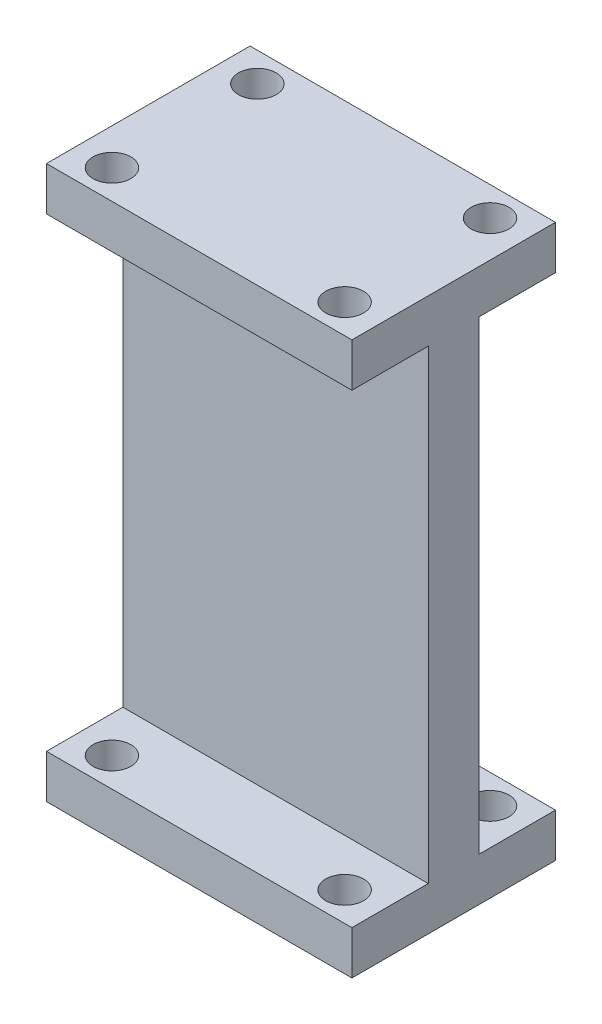
ISO-10303-21;
HEADER;
FILE_DESCRIPTION(('STEP AP214'),'2;1');
FILE_NAME('part.step','',(''),(''),'','','');
FILE_SCHEMA(('AUTOMOTIVE_DESIGN { 1 0 10303 214 1 1 1 1 }'));
ENDSEC;
DATA;
#1=APPLICATION_CONTEXT('core data for automotive mechanical design processes');
#2=APPLICATION_PROTOCOL_DEFINITION('international standard','automotive_design',2000,#1);
#3=PRODUCT_CONTEXT('',#1,'mechanical');
#4=PRODUCT('Part','Part','',(#3));
#5=PRODUCT_RELATED_PRODUCT_CATEGORY('part','',(#4));
#6=PRODUCT_DEFINITION_FORMATION('','',#4);
#7=PRODUCT_DEFINITION_CONTEXT('part definition',#1,'design');
#8=PRODUCT_DEFINITION('design','',#6,#7);
#9=PRODUCT_DEFINITION_SHAPE('','',#8);
#10=(LENGTH_UNIT() NAMED_UNIT(*) SI_UNIT(.MILLI.,.METRE.));
#11=(NAMED_UNIT(*) PLANE_ANGLE_UNIT() SI_UNIT($,.RADIAN.));
#12=(NAMED_UNIT(*) SI_UNIT($,.STERADIAN.) SOLID_ANGLE_UNIT());
#13=UNCERTAINTY_MEASURE_WITH_UNIT(LENGTH_MEASURE(1.E-05),#10,'distance_accuracy_value','');
#14=(GEOMETRIC_REPRESENTATION_CONTEXT(3) GLOBAL_UNCERTAINTY_ASSIGNED_CONTEXT((#13)) GLOBAL_UNIT_ASSIGNED_CONTEXT((#10,
#11,#12)) REPRESENTATION_CONTEXT('',''));
#15=CARTESIAN_POINT('',(0.,0.,0.));
#16=DIRECTION('',(0.,0.,1.));
#17=DIRECTION('',(1.,0.,0.));
#18=AXIS2_PLACEMENT_3D('',#15,#16,#17);
#19=CARTESIAN_POINT('',(0.,3.,0.));
#20=DIRECTION('',(0.,1.,0.));
#21=DIRECTION('',(0.,0.,1.));
#22=AXIS2_PLACEMENT_3D('',#19,#20,#21);
#23=PLANE('',#22);
#24=DIRECTION('',(1.,0.,0.));
#25=VECTOR('',#24,1.);
#26=CARTESIAN_POINT('',(-10.5,3.,1.75));
#27=LINE('',#26,#25);
#28=CARTESIAN_POINT('',(-10.5,3.,1.75));
#29=VERTEX_POINT('',#28);
#30=CARTESIAN_POINT('',(10.5,3.,1.75));
#31=VERTEX_POINT('',#30);
#32=EDGE_CURVE('E48',#29,#31,#27,.T.);
#33=ORIENTED_EDGE('',*,*,#32,.F.);
#34=DIRECTION('',(0.,0.,1.));
#35=VECTOR('',#34,1.);
#36=CARTESIAN_POINT('',(-10.5,3.,-7.));
#37=LINE('',#36,#35);
#38=CARTESIAN_POINT('',(-10.5,3.,7.));
#39=VERTEX_POINT('',#38);
#40=EDGE_CURVE('E204',#29,#39,#37,.T.);
#41=ORIENTED_EDGE('',*,*,#40,.T.);
#42=DIRECTION('',(1.,0.,0.));
#43=VECTOR('',#42,1.);
#44=CARTESIAN_POINT('',(-10.5,3.,7.));
#45=LINE('',#44,#43);
#46=CARTESIAN_POINT('',(10.5,3.,7.));
#47=VERTEX_POINT('',#46);
#48=EDGE_CURVE('E207',#39,#47,#45,.T.);
#49=ORIENTED_EDGE('',*,*,#48,.T.);
#50=DIRECTION('',(0.,0.,-1.));
#51=VECTOR('',#50,1.);
#52=CARTESIAN_POINT('',(10.5,3.,-7.));
#53=LINE('',#52,#51);
#54=EDGE_CURVE('E199',#47,#31,#53,.T.);
#55=ORIENTED_EDGE('',*,*,#54,.T.);
#56=EDGE_LOOP('',(#33,#41,#49,#55));
#57=FACE_BOUND('',#56,.T.);
#58=CARTESIAN_POINT('',(8.,3.,5.));
#59=DIRECTION('',(0.,1.,0.));
#60=DIRECTION('',(0.,0.,1.));
#61=AXIS2_PLACEMENT_3D('',#58,#59,#60);
#62=CIRCLE('',#61,1.3);
#63=CARTESIAN_POINT('',(8.,3.,6.3));
#64=VERTEX_POINT('',#63);
#65=EDGE_CURVE('E187',#64,#64,#62,.T.);
#66=ORIENTED_EDGE('',*,*,#65,.F.);
#67=EDGE_LOOP('',(#66));
#68=FACE_BOUND('',#67,.T.);
#69=CARTESIAN_POINT('',(-8.,3.,5.));
#70=DIRECTION('',(0.,1.,0.));
#71=DIRECTION('',(0.,0.,1.));
#72=AXIS2_PLACEMENT_3D('',#69,#70,#71);
#73=CIRCLE('',#72,1.3);
#74=CARTESIAN_POINT('',(-8.,3.,6.3));
#75=VERTEX_POINT('',#74);
#76=EDGE_CURVE('E193',#75,#75,#73,.T.);
#77=ORIENTED_EDGE('',*,*,#76,.F.);
#78=EDGE_LOOP('',(#77));
#79=FACE_BOUND('',#78,.T.);
#80=ADVANCED_FACE('F33',(#57,#68,#79),#23,.T.);
#81=DIRECTION('',(-1.,0.,0.));
#82=VECTOR('',#81,1.);
#83=CARTESIAN_POINT('',(-10.5,3.,-1.75));
#84=LINE('',#83,#82);
#85=CARTESIAN_POINT('',(10.5,3.,-1.75));
#86=VERTEX_POINT('',#85);
#87=CARTESIAN_POINT('',(-10.5,3.,-1.75));
#88=VERTEX_POINT('',#87);
#89=EDGE_CURVE('E56',#86,#88,#84,.T.);
#90=ORIENTED_EDGE('',*,*,#89,.F.);
#91=CARTESIAN_POINT('',(10.5,3.,-7.));
#92=VERTEX_POINT('',#91);
#93=EDGE_CURVE('E202',#86,#92,#53,.T.);
#94=ORIENTED_EDGE('',*,*,#93,.T.);
#95=DIRECTION('',(-1.,0.,0.));
#96=VECTOR('',#95,1.);
#97=CARTESIAN_POINT('',(-10.5,3.,-7.));
#98=LINE('',#97,#96);
#99=CARTESIAN_POINT('',(-10.5,3.,-7.));
#100=VERTEX_POINT('',#99);
#101=EDGE_CURVE('E201',#92,#100,#98,.T.);
#102=ORIENTED_EDGE('',*,*,#101,.T.);
#103=EDGE_CURVE('E205',#100,#88,#37,.T.);
#104=ORIENTED_EDGE('',*,*,#103,.T.);
#105=EDGE_LOOP('',(#90,#94,#102,#104));
#106=FACE_BOUND('',#105,.T.);
#107=CARTESIAN_POINT('',(8.,3.,-5.));
#108=DIRECTION('',(0.,1.,0.));
#109=DIRECTION('',(0.,0.,-1.));
#110=AXIS2_PLACEMENT_3D('',#107,#108,#109);
#111=CIRCLE('',#110,1.3);
#112=CARTESIAN_POINT('',(8.,3.,-6.3));
#113=VERTEX_POINT('',#112);
#114=EDGE_CURVE('E181',#113,#113,#111,.T.);
#115=ORIENTED_EDGE('',*,*,#114,.F.);
#116=EDGE_LOOP('',(#115));
#117=FACE_BOUND('',#116,.T.);
#118=CARTESIAN_POINT('',(-8.,3.,-5.));
#119=DIRECTION('',(0.,1.,0.));
#120=DIRECTION('',(0.,0.,-1.));
#121=AXIS2_PLACEMENT_3D('',#118,#119,#120);
#122=CIRCLE('',#121,1.3);
#123=CARTESIAN_POINT('',(-8.,3.,-6.3));
#124=VERTEX_POINT('',#123);
#125=EDGE_CURVE('E175',#124,#124,#122,.T.);
#126=ORIENTED_EDGE('',*,*,#125,.F.);
#127=EDGE_LOOP('',(#126));
#128=FACE_BOUND('',#127,.T.);
#129=ADVANCED_FACE('F273',(#106,#117,#128),#23,.T.);
#130=CARTESIAN_POINT('',(0.,0.,0.));
#131=DIRECTION('',(0.,1.,0.));
#132=DIRECTION('',(0.,0.,1.));
#133=AXIS2_PLACEMENT_3D('',#130,#131,#132);
#134=PLANE('',#133);
#135=DIRECTION('',(0.,0.,-1.));
#136=VECTOR('',#135,1.);
#137=CARTESIAN_POINT('',(10.5,0.,-7.));
#138=LINE('',#137,#136);
#139=CARTESIAN_POINT('',(10.5,0.,7.));
#140=VERTEX_POINT('',#139);
#141=CARTESIAN_POINT('',(10.5,0.,-7.));
#142=VERTEX_POINT('',#141);
#143=EDGE_CURVE('E196',#140,#142,#138,.T.);
#144=ORIENTED_EDGE('',*,*,#143,.F.);
#145=DIRECTION('',(1.,0.,0.));
#146=VECTOR('',#145,1.);
#147=CARTESIAN_POINT('',(-10.5,0.,7.));
#148=LINE('',#147,#146);
#149=CARTESIAN_POINT('',(-10.5,0.,7.));
#150=VERTEX_POINT('',#149);
#151=EDGE_CURVE('E215',#150,#140,#148,.T.);
#152=ORIENTED_EDGE('',*,*,#151,.F.);
#153=DIRECTION('',(0.,0.,1.));
#154=VECTOR('',#153,1.);
#155=CARTESIAN_POINT('',(-10.5,0.,-7.));
#156=LINE('',#155,#154);
#157=CARTESIAN_POINT('',(-10.5,0.,-7.));
#158=VERTEX_POINT('',#157);
#159=EDGE_CURVE('E213',#158,#150,#156,.T.);
#160=ORIENTED_EDGE('',*,*,#159,.F.);
#161=DIRECTION('',(-1.,0.,0.));
#162=VECTOR('',#161,1.);
#163=CARTESIAN_POINT('',(-10.5,0.,-7.));
#164=LINE('',#163,#162);
#165=EDGE_CURVE('E211',#142,#158,#164,.T.);
#166=ORIENTED_EDGE('',*,*,#165,.F.);
#167=EDGE_LOOP('',(#144,#152,#160,#166));
#168=FACE_BOUND('',#167,.T.);
#169=CARTESIAN_POINT('',(-8.,0.,5.));
#170=DIRECTION('',(0.,1.,0.));
#171=DIRECTION('',(0.,0.,1.));
#172=AXIS2_PLACEMENT_3D('',#169,#170,#171);
#173=CIRCLE('',#172,1.3);
#174=CARTESIAN_POINT('',(-8.,0.,6.3));
#175=VERTEX_POINT('',#174);
#176=EDGE_CURVE('E190',#175,#175,#173,.T.);
#177=ORIENTED_EDGE('',*,*,#176,.T.);
#178=EDGE_LOOP('',(#177));
#179=FACE_BOUND('',#178,.T.);
#180=CARTESIAN_POINT('',(8.,0.,5.));
#181=DIRECTION('',(0.,1.,0.));
#182=DIRECTION('',(0.,0.,1.));
#183=AXIS2_PLACEMENT_3D('',#180,#181,#182);
#184=CIRCLE('',#183,1.3);
#185=CARTESIAN_POINT('',(8.,0.,6.3));
#186=VERTEX_POINT('',#185);
#187=EDGE_CURVE('E184',#186,#186,#184,.T.);
#188=ORIENTED_EDGE('',*,*,#187,.T.);
#189=EDGE_LOOP('',(#188));
#190=FACE_BOUND('',#189,.T.);
#191=CARTESIAN_POINT('',(8.,0.,-5.));
#192=DIRECTION('',(0.,1.,0.));
#193=DIRECTION('',(0.,0.,-1.));
#194=AXIS2_PLACEMENT_3D('',#191,#192,#193);
#195=CIRCLE('',#194,1.3);
#196=CARTESIAN_POINT('',(8.,0.,-6.3));
#197=VERTEX_POINT('',#196);
#198=EDGE_CURVE('E178',#197,#197,#195,.T.);
#199=ORIENTED_EDGE('',*,*,#198,.T.);
#200=EDGE_LOOP('',(#199));
#201=FACE_BOUND('',#200,.T.);
#202=CARTESIAN_POINT('',(-8.,0.,-5.));
#203=DIRECTION('',(0.,1.,0.));
#204=DIRECTION('',(0.,0.,-1.));
#205=AXIS2_PLACEMENT_3D('',#202,#203,#204);
#206=CIRCLE('',#205,1.3);
#207=CARTESIAN_POINT('',(-8.,0.,-6.3));
#208=VERTEX_POINT('',#207);
#209=EDGE_CURVE('E174',#208,#208,#206,.T.);
#210=ORIENTED_EDGE('',*,*,#209,.T.);
#211=EDGE_LOOP('',(#210));
#212=FACE_BOUND('',#211,.T.);
#213=ADVANCED_FACE('F233',(#168,#179,#190,#201,#212),#134,.F.);
#214=CARTESIAN_POINT('',(10.5,3.,-7.));
#215=DIRECTION('',(-1.,0.,0.));
#216=DIRECTION('',(0.,0.,1.));
#217=AXIS2_PLACEMENT_3D('',#214,#215,#216);
#218=PLANE('',#217);
#219=ORIENTED_EDGE('',*,*,#143,.T.);
#220=DIRECTION('',(0.,-1.,0.));
#221=VECTOR('',#220,1.);
#222=CARTESIAN_POINT('',(10.5,3.,-7.));
#223=LINE('',#222,#221);
#224=EDGE_CURVE('E11',#92,#142,#223,.T.);
#225=ORIENTED_EDGE('',*,*,#224,.F.);
#226=ORIENTED_EDGE('',*,*,#93,.F.);
#227=DIRECTION('',(0.,-1.,0.));
#228=VECTOR('',#227,1.);
#229=CARTESIAN_POINT('',(10.5,35.,-1.75));
#230=LINE('',#229,#228);
#231=CARTESIAN_POINT('',(10.5,35.,-1.75));
#232=VERTEX_POINT('',#231);
#233=EDGE_CURVE('E171',#232,#86,#230,.T.);
#234=ORIENTED_EDGE('',*,*,#233,.F.);
#235=DIRECTION('',(0.,0.,-1.));
#236=VECTOR('',#235,1.);
#237=CARTESIAN_POINT('',(10.5,35.,-7.));
#238=LINE('',#237,#236);
#239=CARTESIAN_POINT('',(10.5,35.,-7.));
#240=VERTEX_POINT('',#239);
#241=EDGE_CURVE('E147',#232,#240,#238,.T.);
#242=ORIENTED_EDGE('',*,*,#241,.T.);
#243=DIRECTION('',(0.,-1.,0.));
#244=VECTOR('',#243,1.);
#245=CARTESIAN_POINT('',(10.5,38.,-7.));
#246=LINE('',#245,#244);
#247=CARTESIAN_POINT('',(10.5,38.,-7.));
#248=VERTEX_POINT('',#247);
#249=EDGE_CURVE('E126',#248,#240,#246,.T.);
#250=ORIENTED_EDGE('',*,*,#249,.F.);
#251=DIRECTION('',(0.,0.,-1.));
#252=VECTOR('',#251,1.);
#253=CARTESIAN_POINT('',(10.5,38.,-7.));
#254=LINE('',#253,#252);
#255=CARTESIAN_POINT('',(10.5,38.,7.));
#256=VERTEX_POINT('',#255);
#257=EDGE_CURVE('E132',#256,#248,#254,.T.);
#258=ORIENTED_EDGE('',*,*,#257,.F.);
#259=DIRECTION('',(0.,-1.,0.));
#260=VECTOR('',#259,1.);
#261=CARTESIAN_POINT('',(10.5,38.,7.));
#262=LINE('',#261,#260);
#263=CARTESIAN_POINT('',(10.5,35.,7.));
#264=VERTEX_POINT('',#263);
#265=EDGE_CURVE('E257',#256,#264,#262,.T.);
#266=ORIENTED_EDGE('',*,*,#265,.T.);
#267=CARTESIAN_POINT('',(10.5,35.,1.75));
#268=VERTEX_POINT('',#267);
#269=EDGE_CURVE('E260',#264,#268,#238,.T.);
#270=ORIENTED_EDGE('',*,*,#269,.T.);
#271=DIRECTION('',(0.,-1.,0.));
#272=VECTOR('',#271,1.);
#273=CARTESIAN_POINT('',(10.5,35.,1.75));
#274=LINE('',#273,#272);
#275=EDGE_CURVE('E160',#268,#31,#274,.T.);
#276=ORIENTED_EDGE('',*,*,#275,.T.);
#277=ORIENTED_EDGE('',*,*,#54,.F.);
#278=DIRECTION('',(0.,-1.,0.));
#279=VECTOR('',#278,1.);
#280=CARTESIAN_POINT('',(10.5,3.,7.));
#281=LINE('',#280,#279);
#282=EDGE_CURVE('E209',#47,#140,#281,.T.);
#283=ORIENTED_EDGE('',*,*,#282,.T.);
#284=EDGE_LOOP('',(#219,#225,#226,#234,#242,#250,#258,#266,#270,#276,#277,#283));
#285=FACE_BOUND('',#284,.T.);
#286=ADVANCED_FACE('F35',(#285),#218,.F.);
#287=CARTESIAN_POINT('',(-10.5,3.,-7.));
#288=DIRECTION('',(0.,0.,1.));
#289=DIRECTION('',(1.,0.,0.));
#290=AXIS2_PLACEMENT_3D('',#287,#288,#289);
#291=PLANE('',#290);
#292=ORIENTED_EDGE('',*,*,#165,.T.);
#293=DIRECTION('',(0.,-1.,0.));
#294=VECTOR('',#293,1.);
#295=CARTESIAN_POINT('',(-10.5,3.,-7.));
#296=LINE('',#295,#294);
#297=EDGE_CURVE('E41',#100,#158,#296,.T.);
#298=ORIENTED_EDGE('',*,*,#297,.F.);
#299=ORIENTED_EDGE('',*,*,#101,.F.);
#300=ORIENTED_EDGE('',*,*,#224,.T.);
#301=EDGE_LOOP('',(#292,#298,#299,#300));
#302=FACE_BOUND('',#301,.T.);
#303=ADVANCED_FACE('F275',(#302),#291,.F.);
#304=CARTESIAN_POINT('',(-10.5,3.,-7.));
#305=DIRECTION('',(1.,0.,0.));
#306=DIRECTION('',(0.,0.,-1.));
#307=AXIS2_PLACEMENT_3D('',#304,#305,#306);
#308=PLANE('',#307);
#309=ORIENTED_EDGE('',*,*,#159,.T.);
#310=DIRECTION('',(0.,-1.,0.));
#311=VECTOR('',#310,1.);
#312=CARTESIAN_POINT('',(-10.5,3.,7.));
#313=LINE('',#312,#311);
#314=EDGE_CURVE('E219',#39,#150,#313,.T.);
#315=ORIENTED_EDGE('',*,*,#314,.F.);
#316=ORIENTED_EDGE('',*,*,#40,.F.);
#317=DIRECTION('',(0.,-1.,0.));
#318=VECTOR('',#317,1.);
#319=CARTESIAN_POINT('',(-10.5,35.,1.75));
#320=LINE('',#319,#318);
#321=CARTESIAN_POINT('',(-10.5,35.,1.75));
#322=VERTEX_POINT('',#321);
#323=EDGE_CURVE('E165',#322,#29,#320,.T.);
#324=ORIENTED_EDGE('',*,*,#323,.F.);
#325=DIRECTION('',(0.,0.,1.));
#326=VECTOR('',#325,1.);
#327=CARTESIAN_POINT('',(-10.5,35.,-7.));
#328=LINE('',#327,#326);
#329=CARTESIAN_POINT('',(-10.5,35.,7.));
#330=VERTEX_POINT('',#329);
#331=EDGE_CURVE('E248',#322,#330,#328,.T.);
#332=ORIENTED_EDGE('',*,*,#331,.T.);
#333=DIRECTION('',(0.,-1.,0.));
#334=VECTOR('',#333,1.);
#335=CARTESIAN_POINT('',(-10.5,38.,7.));
#336=LINE('',#335,#334);
#337=CARTESIAN_POINT('',(-10.5,38.,7.));
#338=VERTEX_POINT('',#337);
#339=EDGE_CURVE('E151',#338,#330,#336,.T.);
#340=ORIENTED_EDGE('',*,*,#339,.F.);
#341=DIRECTION('',(0.,0.,1.));
#342=VECTOR('',#341,1.);
#343=CARTESIAN_POINT('',(-10.5,38.,-7.));
#344=LINE('',#343,#342);
#345=CARTESIAN_POINT('',(-10.5,38.,-7.));
#346=VERTEX_POINT('',#345);
#347=EDGE_CURVE('E131',#346,#338,#344,.T.);
#348=ORIENTED_EDGE('',*,*,#347,.F.);
#349=DIRECTION('',(0.,-1.,0.));
#350=VECTOR('',#349,1.);
#351=CARTESIAN_POINT('',(-10.5,38.,-7.));
#352=LINE('',#351,#350);
#353=CARTESIAN_POINT('',(-10.5,35.,-7.));
#354=VERTEX_POINT('',#353);
#355=EDGE_CURVE('E128',#346,#354,#352,.T.);
#356=ORIENTED_EDGE('',*,*,#355,.T.);
#357=CARTESIAN_POINT('',(-10.5,35.,-1.75));
#358=VERTEX_POINT('',#357);
#359=EDGE_CURVE('E252',#354,#358,#328,.T.);
#360=ORIENTED_EDGE('',*,*,#359,.T.);
#361=DIRECTION('',(0.,-1.,0.));
#362=VECTOR('',#361,1.);
#363=CARTESIAN_POINT('',(-10.5,35.,-1.75));
#364=LINE('',#363,#362);
#365=EDGE_CURVE('E168',#358,#88,#364,.T.);
#366=ORIENTED_EDGE('',*,*,#365,.T.);
#367=ORIENTED_EDGE('',*,*,#103,.F.);
#368=ORIENTED_EDGE('',*,*,#297,.T.);
#369=EDGE_LOOP('',(#309,#315,#316,#324,#332,#340,#348,#356,#360,#366,#367,#368));
#370=FACE_BOUND('',#369,.T.);
#371=ADVANCED_FACE('F226',(#370),#308,.F.);
#372=CARTESIAN_POINT('',(-10.5,3.,7.));
#373=DIRECTION('',(0.,0.,-1.));
#374=DIRECTION('',(-1.,0.,0.));
#375=AXIS2_PLACEMENT_3D('',#372,#373,#374);
#376=PLANE('',#375);
#377=ORIENTED_EDGE('',*,*,#151,.T.);
#378=ORIENTED_EDGE('',*,*,#282,.F.);
#379=ORIENTED_EDGE('',*,*,#48,.F.);
#380=ORIENTED_EDGE('',*,*,#314,.T.);
#381=EDGE_LOOP('',(#377,#378,#379,#380));
#382=FACE_BOUND('',#381,.T.);
#383=ADVANCED_FACE('F237',(#382),#376,.F.);
#384=CARTESIAN_POINT('',(-8.,3.,5.));
#385=DIRECTION('',(0.,-1.,0.));
#386=DIRECTION('',(0.,0.,-1.));
#387=AXIS2_PLACEMENT_3D('',#384,#385,#386);
#388=CYLINDRICAL_SURFACE('',#387,1.3);
#389=ORIENTED_EDGE('',*,*,#76,.T.);
#390=EDGE_LOOP('',(#389));
#391=FACE_BOUND('',#390,.T.);
#392=ORIENTED_EDGE('',*,*,#176,.F.);
#393=EDGE_LOOP('',(#392));
#394=FACE_BOUND('',#393,.T.);
#395=ADVANCED_FACE('F289',(#391,#394),#388,.F.);
#396=CARTESIAN_POINT('',(8.,3.,5.));
#397=DIRECTION('',(0.,-1.,0.));
#398=DIRECTION('',(0.,0.,-1.));
#399=AXIS2_PLACEMENT_3D('',#396,#397,#398);
#400=CYLINDRICAL_SURFACE('',#399,1.3);
#401=ORIENTED_EDGE('',*,*,#65,.T.);
#402=EDGE_LOOP('',(#401));
#403=FACE_BOUND('',#402,.T.);
#404=ORIENTED_EDGE('',*,*,#187,.F.);
#405=EDGE_LOOP('',(#404));
#406=FACE_BOUND('',#405,.T.);
#407=ADVANCED_FACE('F297',(#403,#406),#400,.F.);
#408=CARTESIAN_POINT('',(8.,3.,-5.));
#409=DIRECTION('',(0.,-1.,0.));
#410=DIRECTION('',(0.,0.,-1.));
#411=AXIS2_PLACEMENT_3D('',#408,#409,#410);
#412=CYLINDRICAL_SURFACE('',#411,1.3);
#413=ORIENTED_EDGE('',*,*,#114,.T.);
#414=EDGE_LOOP('',(#413));
#415=FACE_BOUND('',#414,.T.);
#416=ORIENTED_EDGE('',*,*,#198,.F.);
#417=EDGE_LOOP('',(#416));
#418=FACE_BOUND('',#417,.T.);
#419=ADVANCED_FACE('F302',(#415,#418),#412,.F.);
#420=CARTESIAN_POINT('',(-8.,3.,-5.));
#421=DIRECTION('',(0.,-1.,0.));
#422=DIRECTION('',(0.,0.,-1.));
#423=AXIS2_PLACEMENT_3D('',#420,#421,#422);
#424=CYLINDRICAL_SURFACE('',#423,1.3);
#425=ORIENTED_EDGE('',*,*,#125,.T.);
#426=EDGE_LOOP('',(#425));
#427=FACE_BOUND('',#426,.T.);
#428=ORIENTED_EDGE('',*,*,#209,.F.);
#429=EDGE_LOOP('',(#428));
#430=FACE_BOUND('',#429,.T.);
#431=ADVANCED_FACE('F314',(#427,#430),#424,.F.);
#432=CARTESIAN_POINT('',(-10.5,35.,-1.75));
#433=DIRECTION('',(0.,0.,1.));
#434=DIRECTION('',(1.,0.,0.));
#435=AXIS2_PLACEMENT_3D('',#432,#433,#434);
#436=PLANE('',#435);
#437=ORIENTED_EDGE('',*,*,#89,.T.);
#438=ORIENTED_EDGE('',*,*,#365,.F.);
#439=DIRECTION('',(-1.,0.,0.));
#440=VECTOR('',#439,1.);
#441=CARTESIAN_POINT('',(-10.5,35.,-1.75));
#442=LINE('',#441,#440);
#443=EDGE_CURVE('E155',#232,#358,#442,.T.);
#444=ORIENTED_EDGE('',*,*,#443,.F.);
#445=ORIENTED_EDGE('',*,*,#233,.T.);
#446=EDGE_LOOP('',(#437,#438,#444,#445));
#447=FACE_BOUND('',#446,.T.);
#448=ADVANCED_FACE('F272',(#447),#436,.F.);
#449=CARTESIAN_POINT('',(-10.5,35.,1.75));
#450=DIRECTION('',(0.,0.,-1.));
#451=DIRECTION('',(-1.,0.,0.));
#452=AXIS2_PLACEMENT_3D('',#449,#450,#451);
#453=PLANE('',#452);
#454=ORIENTED_EDGE('',*,*,#32,.T.);
#455=ORIENTED_EDGE('',*,*,#275,.F.);
#456=DIRECTION('',(1.,0.,0.));
#457=VECTOR('',#456,1.);
#458=CARTESIAN_POINT('',(-10.5,35.,1.75));
#459=LINE('',#458,#457);
#460=EDGE_CURVE('E158',#322,#268,#459,.T.);
#461=ORIENTED_EDGE('',*,*,#460,.F.);
#462=ORIENTED_EDGE('',*,*,#323,.T.);
#463=EDGE_LOOP('',(#454,#455,#461,#462));
#464=FACE_BOUND('',#463,.T.);
#465=ADVANCED_FACE('F244',(#464),#453,.F.);
#466=CARTESIAN_POINT('',(0.,35.,0.));
#467=DIRECTION('',(0.,1.,0.));
#468=DIRECTION('',(0.,0.,1.));
#469=AXIS2_PLACEMENT_3D('',#466,#467,#468);
#470=PLANE('',#469);
#471=CARTESIAN_POINT('',(-8.,35.,-5.));
#472=DIRECTION('',(0.,1.,0.));
#473=DIRECTION('',(0.,0.,1.));
#474=AXIS2_PLACEMENT_3D('',#471,#472,#473);
#475=CIRCLE('',#474,1.3);
#476=CARTESIAN_POINT('',(-8.,35.,-3.7));
#477=VERTEX_POINT('',#476);
#478=EDGE_CURVE('E370',#477,#477,#475,.T.);
#479=ORIENTED_EDGE('',*,*,#478,.T.);
#480=EDGE_LOOP('',(#479));
#481=FACE_BOUND('',#480,.T.);
#482=CARTESIAN_POINT('',(8.,35.,-5.));
#483=DIRECTION('',(0.,1.,0.));
#484=DIRECTION('',(0.,0.,1.));
#485=AXIS2_PLACEMENT_3D('',#482,#483,#484);
#486=CIRCLE('',#485,1.3);
#487=CARTESIAN_POINT('',(8.,35.,-3.7));
#488=VERTEX_POINT('',#487);
#489=EDGE_CURVE('E364',#488,#488,#486,.T.);
#490=ORIENTED_EDGE('',*,*,#489,.T.);
#491=EDGE_LOOP('',(#490));
#492=FACE_BOUND('',#491,.T.);
#493=ORIENTED_EDGE('',*,*,#241,.F.);
#494=ORIENTED_EDGE('',*,*,#443,.T.);
#495=ORIENTED_EDGE('',*,*,#359,.F.);
#496=DIRECTION('',(-1.,0.,0.));
#497=VECTOR('',#496,1.);
#498=CARTESIAN_POINT('',(-10.5,35.,-7.));
#499=LINE('',#498,#497);
#500=EDGE_CURVE('E253',#240,#354,#499,.T.);
#501=ORIENTED_EDGE('',*,*,#500,.F.);
#502=EDGE_LOOP('',(#493,#494,#495,#501));
#503=FACE_BOUND('',#502,.T.);
#504=ADVANCED_FACE('F270',(#481,#492,#503),#470,.F.);
#505=CARTESIAN_POINT('',(8.,35.,5.));
#506=DIRECTION('',(0.,1.,0.));
#507=DIRECTION('',(0.,0.,1.));
#508=AXIS2_PLACEMENT_3D('',#505,#506,#507);
#509=CIRCLE('',#508,1.3);
#510=CARTESIAN_POINT('',(8.,35.,6.3));
#511=VERTEX_POINT('',#510);
#512=EDGE_CURVE('E361',#511,#511,#509,.T.);
#513=ORIENTED_EDGE('',*,*,#512,.T.);
#514=EDGE_LOOP('',(#513));
#515=FACE_BOUND('',#514,.T.);
#516=CARTESIAN_POINT('',(-8.,35.,5.));
#517=DIRECTION('',(0.,1.,0.));
#518=DIRECTION('',(0.,0.,1.));
#519=AXIS2_PLACEMENT_3D('',#516,#517,#518);
#520=CIRCLE('',#519,1.3);
#521=CARTESIAN_POINT('',(-8.,35.,6.3));
#522=VERTEX_POINT('',#521);
#523=EDGE_CURVE('E376',#522,#522,#520,.T.);
#524=ORIENTED_EDGE('',*,*,#523,.T.);
#525=EDGE_LOOP('',(#524));
#526=FACE_BOUND('',#525,.T.);
#527=ORIENTED_EDGE('',*,*,#331,.F.);
#528=ORIENTED_EDGE('',*,*,#460,.T.);
#529=ORIENTED_EDGE('',*,*,#269,.F.);
#530=DIRECTION('',(1.,0.,0.));
#531=VECTOR('',#530,1.);
#532=CARTESIAN_POINT('',(-10.5,35.,7.));
#533=LINE('',#532,#531);
#534=EDGE_CURVE('E142',#330,#264,#533,.T.);
#535=ORIENTED_EDGE('',*,*,#534,.F.);
#536=EDGE_LOOP('',(#527,#528,#529,#535));
#537=FACE_BOUND('',#536,.T.);
#538=ADVANCED_FACE('F259',(#515,#526,#537),#470,.F.);
#539=CARTESIAN_POINT('',(0.,38.,0.));
#540=DIRECTION('',(0.,1.,0.));
#541=DIRECTION('',(0.,0.,1.));
#542=AXIS2_PLACEMENT_3D('',#539,#540,#541);
#543=PLANE('',#542);
#544=CARTESIAN_POINT('',(8.,38.,-5.));
#545=DIRECTION('',(0.,1.,0.));
#546=DIRECTION('',(0.,0.,1.));
#547=AXIS2_PLACEMENT_3D('',#544,#545,#546);
#548=CIRCLE('',#547,1.3);
#549=CARTESIAN_POINT('',(8.,38.,-3.7));
#550=VERTEX_POINT('',#549);
#551=EDGE_CURVE('E367',#550,#550,#548,.T.);
#552=ORIENTED_EDGE('',*,*,#551,.F.);
#553=EDGE_LOOP('',(#552));
#554=FACE_BOUND('',#553,.T.);
#555=CARTESIAN_POINT('',(-8.,38.,5.));
#556=DIRECTION('',(0.,1.,0.));
#557=DIRECTION('',(0.,0.,1.));
#558=AXIS2_PLACEMENT_3D('',#555,#556,#557);
#559=CIRCLE('',#558,1.3);
#560=CARTESIAN_POINT('',(-8.,38.,6.3));
#561=VERTEX_POINT('',#560);
#562=EDGE_CURVE('E379',#561,#561,#559,.T.);
#563=ORIENTED_EDGE('',*,*,#562,.F.);
#564=EDGE_LOOP('',(#563));
#565=FACE_BOUND('',#564,.T.);
#566=ORIENTED_EDGE('',*,*,#257,.T.);
#567=DIRECTION('',(-1.,0.,0.));
#568=VECTOR('',#567,1.);
#569=CARTESIAN_POINT('',(-10.5,38.,-7.));
#570=LINE('',#569,#568);
#571=EDGE_CURVE('E122',#248,#346,#570,.T.);
#572=ORIENTED_EDGE('',*,*,#571,.T.);
#573=ORIENTED_EDGE('',*,*,#347,.T.);
#574=DIRECTION('',(1.,0.,0.));
#575=VECTOR('',#574,1.);
#576=CARTESIAN_POINT('',(-10.5,38.,7.));
#577=LINE('',#576,#575);
#578=EDGE_CURVE('E138',#338,#256,#577,.T.);
#579=ORIENTED_EDGE('',*,*,#578,.T.);
#580=EDGE_LOOP('',(#566,#572,#573,#579));
#581=FACE_BOUND('',#580,.T.);
#582=CARTESIAN_POINT('',(-8.,38.,-5.));
#583=DIRECTION('',(0.,1.,0.));
#584=DIRECTION('',(0.,0.,1.));
#585=AXIS2_PLACEMENT_3D('',#582,#583,#584);
#586=CIRCLE('',#585,1.3);
#587=CARTESIAN_POINT('',(-8.,38.,-3.7));
#588=VERTEX_POINT('',#587);
#589=EDGE_CURVE('E373',#588,#588,#586,.T.);
#590=ORIENTED_EDGE('',*,*,#589,.F.);
#591=EDGE_LOOP('',(#590));
#592=FACE_BOUND('',#591,.T.);
#593=CARTESIAN_POINT('',(8.,38.,5.));
#594=DIRECTION('',(0.,1.,0.));
#595=DIRECTION('',(0.,0.,1.));
#596=AXIS2_PLACEMENT_3D('',#593,#594,#595);
#597=CIRCLE('',#596,1.3);
#598=CARTESIAN_POINT('',(8.,38.,6.3));
#599=VERTEX_POINT('',#598);
#600=EDGE_CURVE('E358',#599,#599,#597,.T.);
#601=ORIENTED_EDGE('',*,*,#600,.F.);
#602=EDGE_LOOP('',(#601));
#603=FACE_BOUND('',#602,.T.);
#604=ADVANCED_FACE('F135',(#554,#565,#581,#592,#603),#543,.T.);
#605=CARTESIAN_POINT('',(-10.5,38.,-7.));
#606=DIRECTION('',(0.,0.,1.));
#607=DIRECTION('',(1.,0.,0.));
#608=AXIS2_PLACEMENT_3D('',#605,#606,#607);
#609=PLANE('',#608);
#610=ORIENTED_EDGE('',*,*,#500,.T.);
#611=ORIENTED_EDGE('',*,*,#355,.F.);
#612=ORIENTED_EDGE('',*,*,#571,.F.);
#613=ORIENTED_EDGE('',*,*,#249,.T.);
#614=EDGE_LOOP('',(#610,#611,#612,#613));
#615=FACE_BOUND('',#614,.T.);
#616=ADVANCED_FACE('F124',(#615),#609,.F.);
#617=CARTESIAN_POINT('',(-10.5,38.,7.));
#618=DIRECTION('',(0.,0.,-1.));
#619=DIRECTION('',(-1.,0.,0.));
#620=AXIS2_PLACEMENT_3D('',#617,#618,#619);
#621=PLANE('',#620);
#622=ORIENTED_EDGE('',*,*,#534,.T.);
#623=ORIENTED_EDGE('',*,*,#265,.F.);
#624=ORIENTED_EDGE('',*,*,#578,.F.);
#625=ORIENTED_EDGE('',*,*,#339,.T.);
#626=EDGE_LOOP('',(#622,#623,#624,#625));
#627=FACE_BOUND('',#626,.T.);
#628=ADVANCED_FACE('F256',(#627),#621,.F.);
#629=CARTESIAN_POINT('',(-8.,38.,5.));
#630=DIRECTION('',(0.,-1.,0.));
#631=DIRECTION('',(0.,0.,-1.));
#632=AXIS2_PLACEMENT_3D('',#629,#630,#631);
#633=CYLINDRICAL_SURFACE('',#632,1.3);
#634=ORIENTED_EDGE('',*,*,#562,.T.);
#635=EDGE_LOOP('',(#634));
#636=FACE_BOUND('',#635,.T.);
#637=ORIENTED_EDGE('',*,*,#523,.F.);
#638=EDGE_LOOP('',(#637));
#639=FACE_BOUND('',#638,.T.);
#640=ADVANCED_FACE('F332',(#636,#639),#633,.F.);
#641=CARTESIAN_POINT('',(-8.,38.,-5.));
#642=DIRECTION('',(0.,-1.,0.));
#643=DIRECTION('',(0.,0.,-1.));
#644=AXIS2_PLACEMENT_3D('',#641,#642,#643);
#645=CYLINDRICAL_SURFACE('',#644,1.3);
#646=ORIENTED_EDGE('',*,*,#589,.T.);
#647=EDGE_LOOP('',(#646));
#648=FACE_BOUND('',#647,.T.);
#649=ORIENTED_EDGE('',*,*,#478,.F.);
#650=EDGE_LOOP('',(#649));
#651=FACE_BOUND('',#650,.T.);
#652=ADVANCED_FACE('F341',(#648,#651),#645,.F.);
#653=CARTESIAN_POINT('',(8.,38.,-5.));
#654=DIRECTION('',(0.,-1.,0.));
#655=DIRECTION('',(0.,0.,-1.));
#656=AXIS2_PLACEMENT_3D('',#653,#654,#655);
#657=CYLINDRICAL_SURFACE('',#656,1.3);
#658=ORIENTED_EDGE('',*,*,#551,.T.);
#659=EDGE_LOOP('',(#658));
#660=FACE_BOUND('',#659,.T.);
#661=ORIENTED_EDGE('',*,*,#489,.F.);
#662=EDGE_LOOP('',(#661));
#663=FACE_BOUND('',#662,.T.);
#664=ADVANCED_FACE('F345',(#660,#663),#657,.F.);
#665=CARTESIAN_POINT('',(8.,38.,5.));
#666=DIRECTION('',(0.,-1.,0.));
#667=DIRECTION('',(0.,0.,-1.));
#668=AXIS2_PLACEMENT_3D('',#665,#666,#667);
#669=CYLINDRICAL_SURFACE('',#668,1.3);
#670=ORIENTED_EDGE('',*,*,#600,.T.);
#671=EDGE_LOOP('',(#670));
#672=FACE_BOUND('',#671,.T.);
#673=ORIENTED_EDGE('',*,*,#512,.F.);
#674=EDGE_LOOP('',(#673));
#675=FACE_BOUND('',#674,.T.);
#676=ADVANCED_FACE('F349',(#672,#675),#669,.F.);
#677=CLOSED_SHELL('',(#80,#129,#213,#286,#303,#371,#383,#395,#407,#419,#431,#448,#465,#504,#538,
#604,#616,#628,#640,#652,#664,#676));
#678=MANIFOLD_SOLID_BREP('B2',#677);
#679=ADVANCED_BREP_SHAPE_REPRESENTATION('',(#18,#678),#14);
#680=SHAPE_DEFINITION_REPRESENTATION(#9,#679);
ENDSEC;
END-ISO-10303-21;
